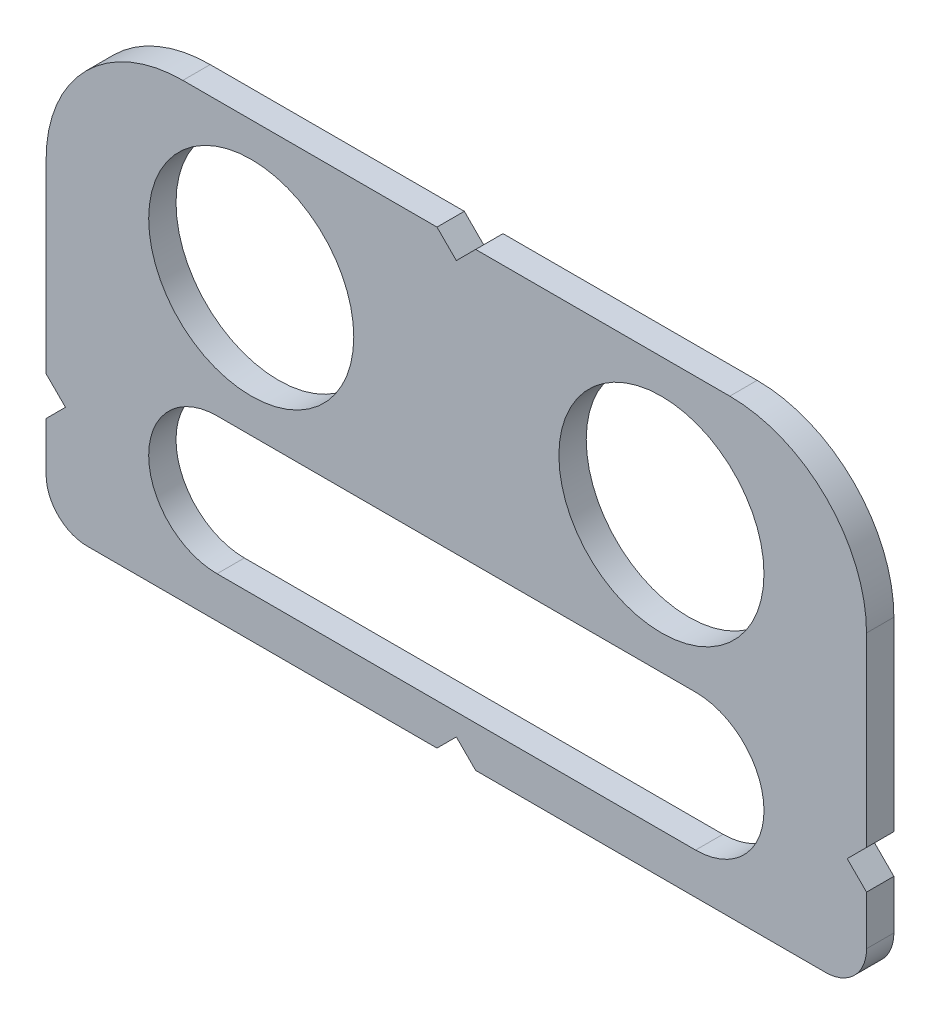
ISO-10303-21;
HEADER;
FILE_DESCRIPTION(('STEP AP214'),'2;1');
FILE_NAME('part.step','',(''),(''),'','','');
FILE_SCHEMA(('AUTOMOTIVE_DESIGN { 1 0 10303 214 1 1 1 1 }'));
ENDSEC;
DATA;
#1=APPLICATION_CONTEXT('core data for automotive mechanical design processes');
#2=APPLICATION_PROTOCOL_DEFINITION('international standard','automotive_design',2000,#1);
#3=PRODUCT_CONTEXT('',#1,'mechanical');
#4=PRODUCT('Part','Part','',(#3));
#5=PRODUCT_RELATED_PRODUCT_CATEGORY('part','',(#4));
#6=PRODUCT_DEFINITION_FORMATION('','',#4);
#7=PRODUCT_DEFINITION_CONTEXT('part definition',#1,'design');
#8=PRODUCT_DEFINITION('design','',#6,#7);
#9=PRODUCT_DEFINITION_SHAPE('','',#8);
#10=(LENGTH_UNIT() NAMED_UNIT(*) SI_UNIT(.MILLI.,.METRE.));
#11=(NAMED_UNIT(*) PLANE_ANGLE_UNIT() SI_UNIT($,.RADIAN.));
#12=(NAMED_UNIT(*) SI_UNIT($,.STERADIAN.) SOLID_ANGLE_UNIT());
#13=UNCERTAINTY_MEASURE_WITH_UNIT(LENGTH_MEASURE(1.E-05),#10,'distance_accuracy_value','');
#14=(GEOMETRIC_REPRESENTATION_CONTEXT(3) GLOBAL_UNCERTAINTY_ASSIGNED_CONTEXT((#13)) GLOBAL_UNIT_ASSIGNED_CONTEXT((#10,
#11,#12)) REPRESENTATION_CONTEXT('',''));
#15=CARTESIAN_POINT('',(0.,0.,0.));
#16=DIRECTION('',(0.,0.,1.));
#17=DIRECTION('',(1.,0.,0.));
#18=AXIS2_PLACEMENT_3D('',#15,#16,#17);
#19=CARTESIAN_POINT('',(20.,15.,2.));
#20=DIRECTION('',(0.,0.,-1.));
#21=DIRECTION('',(-1.,0.,0.));
#22=AXIS2_PLACEMENT_3D('',#19,#20,#21);
#23=PLANE('',#22);
#24=CARTESIAN_POINT('',(-15.,15.,2.));
#25=DIRECTION('',(0.,0.,1.));
#26=DIRECTION('',(-1.,0.,0.));
#27=AXIS2_PLACEMENT_3D('',#24,#25,#26);
#28=CIRCLE('',#27,7.5);
#29=CARTESIAN_POINT('',(-22.5,15.,2.));
#30=VERTEX_POINT('',#29);
#31=EDGE_CURVE('E234',#30,#30,#28,.T.);
#32=ORIENTED_EDGE('',*,*,#31,.F.);
#33=EDGE_LOOP('',(#32));
#34=FACE_BOUND('',#33,.T.);
#35=CARTESIAN_POINT('',(15.,15.,2.));
#36=DIRECTION('',(0.,0.,1.));
#37=DIRECTION('',(1.,0.,0.));
#38=AXIS2_PLACEMENT_3D('',#35,#36,#37);
#39=CIRCLE('',#38,7.5);
#40=CARTESIAN_POINT('',(22.5,15.,2.));
#41=VERTEX_POINT('',#40);
#42=EDGE_CURVE('E240',#41,#41,#39,.T.);
#43=ORIENTED_EDGE('',*,*,#42,.F.);
#44=EDGE_LOOP('',(#43));
#45=FACE_BOUND('',#44,.T.);
#46=CARTESIAN_POINT('',(20.,15.,2.));
#47=DIRECTION('',(0.,0.,1.));
#48=DIRECTION('',(-1.,0.,0.));
#49=AXIS2_PLACEMENT_3D('',#46,#47,#48);
#50=CIRCLE('',#49,9.99999999999999);
#51=CARTESIAN_POINT('',(30.,15.,2.));
#52=VERTEX_POINT('',#51);
#53=CARTESIAN_POINT('',(20.,25.,2.));
#54=VERTEX_POINT('',#53);
#55=EDGE_CURVE('E246',#52,#54,#50,.T.);
#56=ORIENTED_EDGE('',*,*,#55,.T.);
#57=DIRECTION('',(-1.,0.,0.));
#58=VECTOR('',#57,1.);
#59=CARTESIAN_POINT('',(1.41421356237311,25.,2.));
#60=LINE('',#59,#58);
#61=CARTESIAN_POINT('',(1.41421356237311,25.,2.));
#62=VERTEX_POINT('',#61);
#63=EDGE_CURVE('E249',#54,#62,#60,.T.);
#64=ORIENTED_EDGE('',*,*,#63,.T.);
#65=DIRECTION('',(-0.707106781186555,-0.70710678118654,0.));
#66=VECTOR('',#65,1.);
#67=CARTESIAN_POINT('',(1.41421356237311,25.,2.));
#68=LINE('',#67,#66);
#69=CARTESIAN_POINT('',(0.,23.5857864376269,2.));
#70=VERTEX_POINT('',#69);
#71=EDGE_CURVE('E252',#62,#70,#68,.T.);
#72=ORIENTED_EDGE('',*,*,#71,.T.);
#73=DIRECTION('',(-0.707106781186555,0.70710678118654,0.));
#74=VECTOR('',#73,1.);
#75=CARTESIAN_POINT('',(-1.41421356237311,25.,2.));
#76=LINE('',#75,#74);
#77=CARTESIAN_POINT('',(-1.41421356237311,25.,2.));
#78=VERTEX_POINT('',#77);
#79=EDGE_CURVE('E254',#70,#78,#76,.T.);
#80=ORIENTED_EDGE('',*,*,#79,.T.);
#81=DIRECTION('',(-1.,0.,0.));
#82=VECTOR('',#81,1.);
#83=CARTESIAN_POINT('',(-20.,25.,2.));
#84=LINE('',#83,#82);
#85=CARTESIAN_POINT('',(-20.,25.,2.));
#86=VERTEX_POINT('',#85);
#87=EDGE_CURVE('E256',#78,#86,#84,.T.);
#88=ORIENTED_EDGE('',*,*,#87,.T.);
#89=CARTESIAN_POINT('',(-20.,15.,2.));
#90=DIRECTION('',(0.,0.,1.));
#91=DIRECTION('',(1.,0.,0.));
#92=AXIS2_PLACEMENT_3D('',#89,#90,#91);
#93=CIRCLE('',#92,9.99999999999999);
#94=CARTESIAN_POINT('',(-30.,15.,2.));
#95=VERTEX_POINT('',#94);
#96=EDGE_CURVE('E258',#86,#95,#93,.T.);
#97=ORIENTED_EDGE('',*,*,#96,.T.);
#98=DIRECTION('',(0.,-1.,0.));
#99=VECTOR('',#98,1.);
#100=CARTESIAN_POINT('',(-30.,15.,2.));
#101=LINE('',#100,#99);
#102=CARTESIAN_POINT('',(-30.,1.41421356237307,2.));
#103=VERTEX_POINT('',#102);
#104=EDGE_CURVE('E260',#95,#103,#101,.T.);
#105=ORIENTED_EDGE('',*,*,#104,.T.);
#106=DIRECTION('',(0.707106781186552,-0.707106781186543,0.));
#107=VECTOR('',#106,1.);
#108=CARTESIAN_POINT('',(-30.,1.41421356237307,2.));
#109=LINE('',#108,#107);
#110=CARTESIAN_POINT('',(-28.5857864376269,0.,2.));
#111=VERTEX_POINT('',#110);
#112=EDGE_CURVE('E262',#103,#111,#109,.T.);
#113=ORIENTED_EDGE('',*,*,#112,.T.);
#114=DIRECTION('',(-0.707106781186545,-0.70710678118655,0.));
#115=VECTOR('',#114,1.);
#116=CARTESIAN_POINT('',(-28.5857864376269,0.,2.));
#117=LINE('',#116,#115);
#118=CARTESIAN_POINT('',(-30.,-1.4142135623731,2.));
#119=VERTEX_POINT('',#118);
#120=EDGE_CURVE('E264',#111,#119,#117,.T.);
#121=ORIENTED_EDGE('',*,*,#120,.T.);
#122=DIRECTION('',(0.,-1.,0.));
#123=VECTOR('',#122,1.);
#124=CARTESIAN_POINT('',(-30.,-1.4142135623731,2.));
#125=LINE('',#124,#123);
#126=CARTESIAN_POINT('',(-30.,-4.99999999999998,2.));
#127=VERTEX_POINT('',#126);
#128=EDGE_CURVE('E266',#119,#127,#125,.T.);
#129=ORIENTED_EDGE('',*,*,#128,.T.);
#130=CARTESIAN_POINT('',(-27.,-5.,2.));
#131=DIRECTION('',(0.,0.,1.));
#132=DIRECTION('',(1.,0.,0.));
#133=AXIS2_PLACEMENT_3D('',#130,#131,#132);
#134=CIRCLE('',#133,3.);
#135=CARTESIAN_POINT('',(-27.,-8.,2.));
#136=VERTEX_POINT('',#135);
#137=EDGE_CURVE('E268',#127,#136,#134,.T.);
#138=ORIENTED_EDGE('',*,*,#137,.T.);
#139=DIRECTION('',(1.,0.,0.));
#140=VECTOR('',#139,1.);
#141=CARTESIAN_POINT('',(-27.,-8.,2.));
#142=LINE('',#141,#140);
#143=CARTESIAN_POINT('',(-1.41421356237308,-8.,2.));
#144=VERTEX_POINT('',#143);
#145=EDGE_CURVE('E270',#136,#144,#142,.T.);
#146=ORIENTED_EDGE('',*,*,#145,.T.);
#147=DIRECTION('',(0.707106781186542,0.707106781186553,0.));
#148=VECTOR('',#147,1.);
#149=CARTESIAN_POINT('',(0.,-6.58578643762689,2.));
#150=LINE('',#149,#148);
#151=CARTESIAN_POINT('',(0.,-6.58578643762689,2.));
#152=VERTEX_POINT('',#151);
#153=EDGE_CURVE('E272',#144,#152,#150,.T.);
#154=ORIENTED_EDGE('',*,*,#153,.T.);
#155=DIRECTION('',(0.707106781186542,-0.707106781186553,0.));
#156=VECTOR('',#155,1.);
#157=CARTESIAN_POINT('',(0.,-6.58578643762689,2.));
#158=LINE('',#157,#156);
#159=CARTESIAN_POINT('',(1.41421356237309,-8.,2.));
#160=VERTEX_POINT('',#159);
#161=EDGE_CURVE('E274',#152,#160,#158,.T.);
#162=ORIENTED_EDGE('',*,*,#161,.T.);
#163=DIRECTION('',(1.,0.,0.));
#164=VECTOR('',#163,1.);
#165=CARTESIAN_POINT('',(1.41421356237309,-8.,2.));
#166=LINE('',#165,#164);
#167=CARTESIAN_POINT('',(27.,-7.99999999999999,2.));
#168=VERTEX_POINT('',#167);
#169=EDGE_CURVE('E276',#160,#168,#166,.T.);
#170=ORIENTED_EDGE('',*,*,#169,.T.);
#171=CARTESIAN_POINT('',(27.,-4.99999999999999,2.));
#172=DIRECTION('',(0.,0.,1.));
#173=DIRECTION('',(1.,0.,0.));
#174=AXIS2_PLACEMENT_3D('',#171,#172,#173);
#175=CIRCLE('',#174,3.);
#176=CARTESIAN_POINT('',(30.,-4.99999999999999,2.));
#177=VERTEX_POINT('',#176);
#178=EDGE_CURVE('E278',#168,#177,#175,.T.);
#179=ORIENTED_EDGE('',*,*,#178,.T.);
#180=DIRECTION('',(0.,1.,0.));
#181=VECTOR('',#180,1.);
#182=CARTESIAN_POINT('',(30.,-1.4142135623731,2.));
#183=LINE('',#182,#181);
#184=CARTESIAN_POINT('',(30.,-1.4142135623731,2.));
#185=VERTEX_POINT('',#184);
#186=EDGE_CURVE('E280',#177,#185,#183,.T.);
#187=ORIENTED_EDGE('',*,*,#186,.T.);
#188=DIRECTION('',(-0.707106781186545,0.70710678118655,0.));
#189=VECTOR('',#188,1.);
#190=CARTESIAN_POINT('',(28.5857864376269,0.,2.));
#191=LINE('',#190,#189);
#192=CARTESIAN_POINT('',(28.5857864376269,0.,2.));
#193=VERTEX_POINT('',#192);
#194=EDGE_CURVE('E282',#185,#193,#191,.T.);
#195=ORIENTED_EDGE('',*,*,#194,.T.);
#196=DIRECTION('',(0.707106781186551,0.707106781186544,0.));
#197=VECTOR('',#196,1.);
#198=CARTESIAN_POINT('',(30.,1.41421356237308,2.));
#199=LINE('',#198,#197);
#200=CARTESIAN_POINT('',(30.,1.41421356237308,2.));
#201=VERTEX_POINT('',#200);
#202=EDGE_CURVE('E284',#193,#201,#199,.T.);
#203=ORIENTED_EDGE('',*,*,#202,.T.);
#204=DIRECTION('',(0.,1.,0.));
#205=VECTOR('',#204,1.);
#206=CARTESIAN_POINT('',(30.,15.,2.));
#207=LINE('',#206,#205);
#208=EDGE_CURVE('E286',#201,#52,#207,.T.);
#209=ORIENTED_EDGE('',*,*,#208,.T.);
#210=EDGE_LOOP('',(#56,#64,#72,#80,#88,#97,#105,#113,#121,#129,#138,#146,#154,#162,#170,#179,
#187,#195,#203,#209));
#211=FACE_BOUND('',#210,.T.);
#212=CARTESIAN_POINT('',(-17.5,0.,2.));
#213=DIRECTION('',(0.,0.,1.));
#214=DIRECTION('',(1.,0.,0.));
#215=AXIS2_PLACEMENT_3D('',#212,#213,#214);
#216=CIRCLE('',#215,5.);
#217=CARTESIAN_POINT('',(-17.5,5.,2.));
#218=VERTEX_POINT('',#217);
#219=CARTESIAN_POINT('',(-17.5,-5.,2.));
#220=VERTEX_POINT('',#219);
#221=EDGE_CURVE('E198',#218,#220,#216,.T.);
#222=ORIENTED_EDGE('',*,*,#221,.F.);
#223=DIRECTION('',(-1.,0.,0.));
#224=VECTOR('',#223,1.);
#225=CARTESIAN_POINT('',(-17.5,5.,2.));
#226=LINE('',#225,#224);
#227=CARTESIAN_POINT('',(17.5,5.00000000000001,2.));
#228=VERTEX_POINT('',#227);
#229=EDGE_CURVE('E220',#228,#218,#226,.T.);
#230=ORIENTED_EDGE('',*,*,#229,.F.);
#231=CARTESIAN_POINT('',(17.5,0.,2.));
#232=DIRECTION('',(0.,0.,1.));
#233=DIRECTION('',(1.,0.,0.));
#234=AXIS2_PLACEMENT_3D('',#231,#232,#233);
#235=CIRCLE('',#234,5.);
#236=CARTESIAN_POINT('',(17.5,-4.99999999999999,2.));
#237=VERTEX_POINT('',#236);
#238=EDGE_CURVE('E218',#237,#228,#235,.T.);
#239=ORIENTED_EDGE('',*,*,#238,.F.);
#240=DIRECTION('',(1.,0.,0.));
#241=VECTOR('',#240,1.);
#242=CARTESIAN_POINT('',(-17.5,-5.,2.));
#243=LINE('',#242,#241);
#244=EDGE_CURVE('E206',#220,#237,#243,.T.);
#245=ORIENTED_EDGE('',*,*,#244,.F.);
#246=EDGE_LOOP('',(#222,#230,#239,#245));
#247=FACE_BOUND('',#246,.T.);
#248=ADVANCED_FACE('F37',(#34,#45,#211,#247),#23,.F.);
#249=CARTESIAN_POINT('',(20.,15.,0.));
#250=DIRECTION('',(0.,0.,-1.));
#251=DIRECTION('',(-1.,0.,0.));
#252=AXIS2_PLACEMENT_3D('',#249,#250,#251);
#253=PLANE('',#252);
#254=CARTESIAN_POINT('',(15.,15.,0.));
#255=DIRECTION('',(0.,0.,1.));
#256=DIRECTION('',(1.,0.,0.));
#257=AXIS2_PLACEMENT_3D('',#254,#255,#256);
#258=CIRCLE('',#257,7.5);
#259=CARTESIAN_POINT('',(22.5,15.,0.));
#260=VERTEX_POINT('',#259);
#261=EDGE_CURVE('E237',#260,#260,#258,.T.);
#262=ORIENTED_EDGE('',*,*,#261,.T.);
#263=EDGE_LOOP('',(#262));
#264=FACE_BOUND('',#263,.T.);
#265=CARTESIAN_POINT('',(20.,15.,0.));
#266=DIRECTION('',(0.,0.,1.));
#267=DIRECTION('',(-1.,0.,0.));
#268=AXIS2_PLACEMENT_3D('',#265,#266,#267);
#269=CIRCLE('',#268,9.99999999999999);
#270=CARTESIAN_POINT('',(30.,15.,0.));
#271=VERTEX_POINT('',#270);
#272=CARTESIAN_POINT('',(20.,25.,0.));
#273=VERTEX_POINT('',#272);
#274=EDGE_CURVE('E243',#271,#273,#269,.T.);
#275=ORIENTED_EDGE('',*,*,#274,.F.);
#276=DIRECTION('',(0.,1.,0.));
#277=VECTOR('',#276,1.);
#278=CARTESIAN_POINT('',(30.,15.,0.));
#279=LINE('',#278,#277);
#280=CARTESIAN_POINT('',(30.,1.41421356237308,0.));
#281=VERTEX_POINT('',#280);
#282=EDGE_CURVE('E250',#281,#271,#279,.T.);
#283=ORIENTED_EDGE('',*,*,#282,.F.);
#284=DIRECTION('',(0.707106781186551,0.707106781186544,0.));
#285=VECTOR('',#284,1.);
#286=CARTESIAN_POINT('',(30.,1.41421356237308,0.));
#287=LINE('',#286,#285);
#288=CARTESIAN_POINT('',(28.5857864376269,0.,0.));
#289=VERTEX_POINT('',#288);
#290=EDGE_CURVE('E325',#289,#281,#287,.T.);
#291=ORIENTED_EDGE('',*,*,#290,.F.);
#292=DIRECTION('',(-0.707106781186545,0.70710678118655,0.));
#293=VECTOR('',#292,1.);
#294=CARTESIAN_POINT('',(28.5857864376269,0.,0.));
#295=LINE('',#294,#293);
#296=CARTESIAN_POINT('',(30.,-1.4142135623731,0.));
#297=VERTEX_POINT('',#296);
#298=EDGE_CURVE('E323',#297,#289,#295,.T.);
#299=ORIENTED_EDGE('',*,*,#298,.F.);
#300=DIRECTION('',(0.,1.,0.));
#301=VECTOR('',#300,1.);
#302=CARTESIAN_POINT('',(30.,-1.4142135623731,0.));
#303=LINE('',#302,#301);
#304=CARTESIAN_POINT('',(30.,-4.99999999999999,0.));
#305=VERTEX_POINT('',#304);
#306=EDGE_CURVE('E321',#305,#297,#303,.T.);
#307=ORIENTED_EDGE('',*,*,#306,.F.);
#308=CARTESIAN_POINT('',(27.,-4.99999999999999,0.));
#309=DIRECTION('',(0.,0.,1.));
#310=DIRECTION('',(1.,0.,0.));
#311=AXIS2_PLACEMENT_3D('',#308,#309,#310);
#312=CIRCLE('',#311,3.);
#313=CARTESIAN_POINT('',(27.,-7.99999999999999,0.));
#314=VERTEX_POINT('',#313);
#315=EDGE_CURVE('E319',#314,#305,#312,.T.);
#316=ORIENTED_EDGE('',*,*,#315,.F.);
#317=DIRECTION('',(1.,0.,0.));
#318=VECTOR('',#317,1.);
#319=CARTESIAN_POINT('',(1.41421356237309,-8.,0.));
#320=LINE('',#319,#318);
#321=CARTESIAN_POINT('',(1.41421356237309,-8.,0.));
#322=VERTEX_POINT('',#321);
#323=EDGE_CURVE('E317',#322,#314,#320,.T.);
#324=ORIENTED_EDGE('',*,*,#323,.F.);
#325=DIRECTION('',(0.707106781186542,-0.707106781186553,0.));
#326=VECTOR('',#325,1.);
#327=CARTESIAN_POINT('',(0.,-6.58578643762689,0.));
#328=LINE('',#327,#326);
#329=CARTESIAN_POINT('',(0.,-6.58578643762689,0.));
#330=VERTEX_POINT('',#329);
#331=EDGE_CURVE('E315',#330,#322,#328,.T.);
#332=ORIENTED_EDGE('',*,*,#331,.F.);
#333=DIRECTION('',(0.707106781186542,0.707106781186553,0.));
#334=VECTOR('',#333,1.);
#335=CARTESIAN_POINT('',(0.,-6.58578643762689,0.));
#336=LINE('',#335,#334);
#337=CARTESIAN_POINT('',(-1.41421356237308,-8.,0.));
#338=VERTEX_POINT('',#337);
#339=EDGE_CURVE('E313',#338,#330,#336,.T.);
#340=ORIENTED_EDGE('',*,*,#339,.F.);
#341=DIRECTION('',(1.,0.,0.));
#342=VECTOR('',#341,1.);
#343=CARTESIAN_POINT('',(-27.,-8.,0.));
#344=LINE('',#343,#342);
#345=CARTESIAN_POINT('',(-27.,-8.,0.));
#346=VERTEX_POINT('',#345);
#347=EDGE_CURVE('E311',#346,#338,#344,.T.);
#348=ORIENTED_EDGE('',*,*,#347,.F.);
#349=CARTESIAN_POINT('',(-27.,-5.,0.));
#350=DIRECTION('',(0.,0.,1.));
#351=DIRECTION('',(1.,0.,0.));
#352=AXIS2_PLACEMENT_3D('',#349,#350,#351);
#353=CIRCLE('',#352,3.);
#354=CARTESIAN_POINT('',(-30.,-4.99999999999998,0.));
#355=VERTEX_POINT('',#354);
#356=EDGE_CURVE('E309',#355,#346,#353,.T.);
#357=ORIENTED_EDGE('',*,*,#356,.F.);
#358=DIRECTION('',(0.,-1.,0.));
#359=VECTOR('',#358,1.);
#360=CARTESIAN_POINT('',(-30.,-1.4142135623731,0.));
#361=LINE('',#360,#359);
#362=CARTESIAN_POINT('',(-30.,-1.4142135623731,0.));
#363=VERTEX_POINT('',#362);
#364=EDGE_CURVE('E307',#363,#355,#361,.T.);
#365=ORIENTED_EDGE('',*,*,#364,.F.);
#366=DIRECTION('',(-0.707106781186545,-0.70710678118655,0.));
#367=VECTOR('',#366,1.);
#368=CARTESIAN_POINT('',(-28.5857864376269,0.,0.));
#369=LINE('',#368,#367);
#370=CARTESIAN_POINT('',(-28.5857864376269,0.,0.));
#371=VERTEX_POINT('',#370);
#372=EDGE_CURVE('E305',#371,#363,#369,.T.);
#373=ORIENTED_EDGE('',*,*,#372,.F.);
#374=DIRECTION('',(0.707106781186552,-0.707106781186543,0.));
#375=VECTOR('',#374,1.);
#376=CARTESIAN_POINT('',(-30.,1.41421356237307,0.));
#377=LINE('',#376,#375);
#378=CARTESIAN_POINT('',(-30.,1.41421356237307,0.));
#379=VERTEX_POINT('',#378);
#380=EDGE_CURVE('E303',#379,#371,#377,.T.);
#381=ORIENTED_EDGE('',*,*,#380,.F.);
#382=DIRECTION('',(0.,-1.,0.));
#383=VECTOR('',#382,1.);
#384=CARTESIAN_POINT('',(-30.,15.,0.));
#385=LINE('',#384,#383);
#386=CARTESIAN_POINT('',(-30.,15.,0.));
#387=VERTEX_POINT('',#386);
#388=EDGE_CURVE('E301',#387,#379,#385,.T.);
#389=ORIENTED_EDGE('',*,*,#388,.F.);
#390=CARTESIAN_POINT('',(-20.,15.,0.));
#391=DIRECTION('',(0.,0.,1.));
#392=DIRECTION('',(1.,0.,0.));
#393=AXIS2_PLACEMENT_3D('',#390,#391,#392);
#394=CIRCLE('',#393,9.99999999999999);
#395=CARTESIAN_POINT('',(-20.,25.,0.));
#396=VERTEX_POINT('',#395);
#397=EDGE_CURVE('E299',#396,#387,#394,.T.);
#398=ORIENTED_EDGE('',*,*,#397,.F.);
#399=DIRECTION('',(-1.,0.,0.));
#400=VECTOR('',#399,1.);
#401=CARTESIAN_POINT('',(-20.,25.,0.));
#402=LINE('',#401,#400);
#403=CARTESIAN_POINT('',(-1.41421356237311,25.,0.));
#404=VERTEX_POINT('',#403);
#405=EDGE_CURVE('E297',#404,#396,#402,.T.);
#406=ORIENTED_EDGE('',*,*,#405,.F.);
#407=DIRECTION('',(-0.707106781186555,0.70710678118654,0.));
#408=VECTOR('',#407,1.);
#409=CARTESIAN_POINT('',(-1.41421356237311,25.,0.));
#410=LINE('',#409,#408);
#411=CARTESIAN_POINT('',(0.,23.5857864376269,0.));
#412=VERTEX_POINT('',#411);
#413=EDGE_CURVE('E295',#412,#404,#410,.T.);
#414=ORIENTED_EDGE('',*,*,#413,.F.);
#415=DIRECTION('',(-0.707106781186555,-0.70710678118654,0.));
#416=VECTOR('',#415,1.);
#417=CARTESIAN_POINT('',(1.41421356237311,25.,0.));
#418=LINE('',#417,#416);
#419=CARTESIAN_POINT('',(1.41421356237311,25.,0.));
#420=VERTEX_POINT('',#419);
#421=EDGE_CURVE('E293',#420,#412,#418,.T.);
#422=ORIENTED_EDGE('',*,*,#421,.F.);
#423=DIRECTION('',(-1.,0.,0.));
#424=VECTOR('',#423,1.);
#425=CARTESIAN_POINT('',(1.41421356237311,25.,0.));
#426=LINE('',#425,#424);
#427=EDGE_CURVE('E291',#273,#420,#426,.T.);
#428=ORIENTED_EDGE('',*,*,#427,.F.);
#429=EDGE_LOOP('',(#275,#283,#291,#299,#307,#316,#324,#332,#340,#348,#357,#365,#373,#381,#389,
#398,#406,#414,#422,#428));
#430=FACE_BOUND('',#429,.T.);
#431=CARTESIAN_POINT('',(-15.,15.,0.));
#432=DIRECTION('',(0.,0.,1.));
#433=DIRECTION('',(-1.,0.,0.));
#434=AXIS2_PLACEMENT_3D('',#431,#432,#433);
#435=CIRCLE('',#434,7.5);
#436=CARTESIAN_POINT('',(-22.5,15.,0.));
#437=VERTEX_POINT('',#436);
#438=EDGE_CURVE('E214',#437,#437,#435,.T.);
#439=ORIENTED_EDGE('',*,*,#438,.T.);
#440=EDGE_LOOP('',(#439));
#441=FACE_BOUND('',#440,.T.);
#442=DIRECTION('',(-1.,0.,0.));
#443=VECTOR('',#442,1.);
#444=CARTESIAN_POINT('',(-17.5,5.,0.));
#445=LINE('',#444,#443);
#446=CARTESIAN_POINT('',(17.5,5.00000000000001,0.));
#447=VERTEX_POINT('',#446);
#448=CARTESIAN_POINT('',(-17.5,5.,0.));
#449=VERTEX_POINT('',#448);
#450=EDGE_CURVE('E207',#447,#449,#445,.T.);
#451=ORIENTED_EDGE('',*,*,#450,.T.);
#452=CARTESIAN_POINT('',(-17.5,0.,0.));
#453=DIRECTION('',(0.,0.,1.));
#454=DIRECTION('',(1.,0.,0.));
#455=AXIS2_PLACEMENT_3D('',#452,#453,#454);
#456=CIRCLE('',#455,5.);
#457=CARTESIAN_POINT('',(-17.5,-5.,0.));
#458=VERTEX_POINT('',#457);
#459=EDGE_CURVE('E60',#449,#458,#456,.T.);
#460=ORIENTED_EDGE('',*,*,#459,.T.);
#461=DIRECTION('',(1.,0.,0.));
#462=VECTOR('',#461,1.);
#463=CARTESIAN_POINT('',(-17.5,-5.,0.));
#464=LINE('',#463,#462);
#465=CARTESIAN_POINT('',(17.5,-4.99999999999999,0.));
#466=VERTEX_POINT('',#465);
#467=EDGE_CURVE('E213',#458,#466,#464,.T.);
#468=ORIENTED_EDGE('',*,*,#467,.T.);
#469=CARTESIAN_POINT('',(17.5,0.,0.));
#470=DIRECTION('',(0.,0.,1.));
#471=DIRECTION('',(1.,0.,0.));
#472=AXIS2_PLACEMENT_3D('',#469,#470,#471);
#473=CIRCLE('',#472,5.);
#474=EDGE_CURVE('E226',#466,#447,#473,.T.);
#475=ORIENTED_EDGE('',*,*,#474,.T.);
#476=EDGE_LOOP('',(#451,#460,#468,#475));
#477=FACE_BOUND('',#476,.T.);
#478=ADVANCED_FACE('F391',(#264,#430,#441,#477),#253,.T.);
#479=CARTESIAN_POINT('',(20.,15.,2.));
#480=DIRECTION('',(0.,0.,-1.));
#481=DIRECTION('',(-1.,0.,0.));
#482=AXIS2_PLACEMENT_3D('',#479,#480,#481);
#483=CYLINDRICAL_SURFACE('',#482,9.99999999999999);
#484=ORIENTED_EDGE('',*,*,#274,.T.);
#485=DIRECTION('',(0.,0.,-1.));
#486=VECTOR('',#485,1.);
#487=CARTESIAN_POINT('',(20.,25.,2.));
#488=LINE('',#487,#486);
#489=EDGE_CURVE('E11',#54,#273,#488,.T.);
#490=ORIENTED_EDGE('',*,*,#489,.F.);
#491=ORIENTED_EDGE('',*,*,#55,.F.);
#492=DIRECTION('',(0.,0.,-1.));
#493=VECTOR('',#492,1.);
#494=CARTESIAN_POINT('',(30.,15.,2.));
#495=LINE('',#494,#493);
#496=EDGE_CURVE('E288',#52,#271,#495,.T.);
#497=ORIENTED_EDGE('',*,*,#496,.T.);
#498=EDGE_LOOP('',(#484,#490,#491,#497));
#499=FACE_BOUND('',#498,.T.);
#500=ADVANCED_FACE('F39',(#499),#483,.T.);
#501=CARTESIAN_POINT('',(1.41421356237311,25.,2.));
#502=DIRECTION('',(0.,-1.,0.));
#503=DIRECTION('',(1.,0.,0.));
#504=AXIS2_PLACEMENT_3D('',#501,#502,#503);
#505=PLANE('',#504);
#506=ORIENTED_EDGE('',*,*,#427,.T.);
#507=DIRECTION('',(0.,0.,-1.));
#508=VECTOR('',#507,1.);
#509=CARTESIAN_POINT('',(1.41421356237311,25.,2.));
#510=LINE('',#509,#508);
#511=EDGE_CURVE('E45',#62,#420,#510,.T.);
#512=ORIENTED_EDGE('',*,*,#511,.F.);
#513=ORIENTED_EDGE('',*,*,#63,.F.);
#514=ORIENTED_EDGE('',*,*,#489,.T.);
#515=EDGE_LOOP('',(#506,#512,#513,#514));
#516=FACE_BOUND('',#515,.T.);
#517=ADVANCED_FACE('F408',(#516),#505,.F.);
#518=CARTESIAN_POINT('',(1.41421356237311,25.,2.));
#519=DIRECTION('',(0.70710678118654,-0.707106781186555,0.));
#520=DIRECTION('',(0.707106781186555,0.70710678118654,0.));
#521=AXIS2_PLACEMENT_3D('',#518,#519,#520);
#522=PLANE('',#521);
#523=ORIENTED_EDGE('',*,*,#421,.T.);
#524=DIRECTION('',(0.,0.,-1.));
#525=VECTOR('',#524,1.);
#526=CARTESIAN_POINT('',(0.,23.5857864376269,2.));
#527=LINE('',#526,#525);
#528=EDGE_CURVE('E378',#70,#412,#527,.T.);
#529=ORIENTED_EDGE('',*,*,#528,.F.);
#530=ORIENTED_EDGE('',*,*,#71,.F.);
#531=ORIENTED_EDGE('',*,*,#511,.T.);
#532=EDGE_LOOP('',(#523,#529,#530,#531));
#533=FACE_BOUND('',#532,.T.);
#534=ADVANCED_FACE('F385',(#533),#522,.F.);
#535=CARTESIAN_POINT('',(-1.41421356237311,25.,2.));
#536=DIRECTION('',(-0.70710678118654,-0.707106781186555,0.));
#537=DIRECTION('',(0.707106781186555,-0.70710678118654,0.));
#538=AXIS2_PLACEMENT_3D('',#535,#536,#537);
#539=PLANE('',#538);
#540=ORIENTED_EDGE('',*,*,#413,.T.);
#541=DIRECTION('',(0.,0.,-1.));
#542=VECTOR('',#541,1.);
#543=CARTESIAN_POINT('',(-1.41421356237311,25.,2.));
#544=LINE('',#543,#542);
#545=EDGE_CURVE('E375',#78,#404,#544,.T.);
#546=ORIENTED_EDGE('',*,*,#545,.F.);
#547=ORIENTED_EDGE('',*,*,#79,.F.);
#548=ORIENTED_EDGE('',*,*,#528,.T.);
#549=EDGE_LOOP('',(#540,#546,#547,#548));
#550=FACE_BOUND('',#549,.T.);
#551=ADVANCED_FACE('F397',(#550),#539,.F.);
#552=CARTESIAN_POINT('',(-20.,25.,2.));
#553=DIRECTION('',(0.,-1.,0.));
#554=DIRECTION('',(1.,0.,0.));
#555=AXIS2_PLACEMENT_3D('',#552,#553,#554);
#556=PLANE('',#555);
#557=ORIENTED_EDGE('',*,*,#405,.T.);
#558=DIRECTION('',(0.,0.,-1.));
#559=VECTOR('',#558,1.);
#560=CARTESIAN_POINT('',(-20.,25.,2.));
#561=LINE('',#560,#559);
#562=EDGE_CURVE('E372',#86,#396,#561,.T.);
#563=ORIENTED_EDGE('',*,*,#562,.F.);
#564=ORIENTED_EDGE('',*,*,#87,.F.);
#565=ORIENTED_EDGE('',*,*,#545,.T.);
#566=EDGE_LOOP('',(#557,#563,#564,#565));
#567=FACE_BOUND('',#566,.T.);
#568=ADVANCED_FACE('F401',(#567),#556,.F.);
#569=CARTESIAN_POINT('',(-20.,15.,2.));
#570=DIRECTION('',(0.,0.,-1.));
#571=DIRECTION('',(-1.,0.,0.));
#572=AXIS2_PLACEMENT_3D('',#569,#570,#571);
#573=CYLINDRICAL_SURFACE('',#572,9.99999999999999);
#574=ORIENTED_EDGE('',*,*,#397,.T.);
#575=DIRECTION('',(0.,0.,-1.));
#576=VECTOR('',#575,1.);
#577=CARTESIAN_POINT('',(-30.,15.,2.));
#578=LINE('',#577,#576);
#579=EDGE_CURVE('E369',#95,#387,#578,.T.);
#580=ORIENTED_EDGE('',*,*,#579,.F.);
#581=ORIENTED_EDGE('',*,*,#96,.F.);
#582=ORIENTED_EDGE('',*,*,#562,.T.);
#583=EDGE_LOOP('',(#574,#580,#581,#582));
#584=FACE_BOUND('',#583,.T.);
#585=ADVANCED_FACE('F481',(#584),#573,.T.);
#586=CARTESIAN_POINT('',(-30.,15.,2.));
#587=DIRECTION('',(1.,0.,0.));
#588=DIRECTION('',(0.,1.,0.));
#589=AXIS2_PLACEMENT_3D('',#586,#587,#588);
#590=PLANE('',#589);
#591=ORIENTED_EDGE('',*,*,#388,.T.);
#592=DIRECTION('',(0.,0.,-1.));
#593=VECTOR('',#592,1.);
#594=CARTESIAN_POINT('',(-30.,1.41421356237307,2.));
#595=LINE('',#594,#593);
#596=EDGE_CURVE('E366',#103,#379,#595,.T.);
#597=ORIENTED_EDGE('',*,*,#596,.F.);
#598=ORIENTED_EDGE('',*,*,#104,.F.);
#599=ORIENTED_EDGE('',*,*,#579,.T.);
#600=EDGE_LOOP('',(#591,#597,#598,#599));
#601=FACE_BOUND('',#600,.T.);
#602=ADVANCED_FACE('F479',(#601),#590,.F.);
#603=CARTESIAN_POINT('',(-30.,1.41421356237307,2.));
#604=DIRECTION('',(0.707106781186543,0.707106781186552,0.));
#605=DIRECTION('',(-0.707106781186552,0.707106781186543,0.));
#606=AXIS2_PLACEMENT_3D('',#603,#604,#605);
#607=PLANE('',#606);
#608=ORIENTED_EDGE('',*,*,#380,.T.);
#609=DIRECTION('',(0.,0.,-1.));
#610=VECTOR('',#609,1.);
#611=CARTESIAN_POINT('',(-28.5857864376269,0.,2.));
#612=LINE('',#611,#610);
#613=EDGE_CURVE('E363',#111,#371,#612,.T.);
#614=ORIENTED_EDGE('',*,*,#613,.F.);
#615=ORIENTED_EDGE('',*,*,#112,.F.);
#616=ORIENTED_EDGE('',*,*,#596,.T.);
#617=EDGE_LOOP('',(#608,#614,#615,#616));
#618=FACE_BOUND('',#617,.T.);
#619=ADVANCED_FACE('F474',(#618),#607,.F.);
#620=CARTESIAN_POINT('',(-28.5857864376269,0.,2.));
#621=DIRECTION('',(0.70710678118655,-0.707106781186545,0.));
#622=DIRECTION('',(0.707106781186545,0.70710678118655,0.));
#623=AXIS2_PLACEMENT_3D('',#620,#621,#622);
#624=PLANE('',#623);
#625=ORIENTED_EDGE('',*,*,#372,.T.);
#626=DIRECTION('',(0.,0.,-1.));
#627=VECTOR('',#626,1.);
#628=CARTESIAN_POINT('',(-30.,-1.4142135623731,2.));
#629=LINE('',#628,#627);
#630=EDGE_CURVE('E360',#119,#363,#629,.T.);
#631=ORIENTED_EDGE('',*,*,#630,.F.);
#632=ORIENTED_EDGE('',*,*,#120,.F.);
#633=ORIENTED_EDGE('',*,*,#613,.T.);
#634=EDGE_LOOP('',(#625,#631,#632,#633));
#635=FACE_BOUND('',#634,.T.);
#636=ADVANCED_FACE('F469',(#635),#624,.F.);
#637=CARTESIAN_POINT('',(-30.,-1.4142135623731,2.));
#638=DIRECTION('',(1.,0.,0.));
#639=DIRECTION('',(0.,1.,0.));
#640=AXIS2_PLACEMENT_3D('',#637,#638,#639);
#641=PLANE('',#640);
#642=ORIENTED_EDGE('',*,*,#364,.T.);
#643=DIRECTION('',(0.,0.,-1.));
#644=VECTOR('',#643,1.);
#645=CARTESIAN_POINT('',(-30.,-4.99999999999998,2.));
#646=LINE('',#645,#644);
#647=EDGE_CURVE('E357',#127,#355,#646,.T.);
#648=ORIENTED_EDGE('',*,*,#647,.F.);
#649=ORIENTED_EDGE('',*,*,#128,.F.);
#650=ORIENTED_EDGE('',*,*,#630,.T.);
#651=EDGE_LOOP('',(#642,#648,#649,#650));
#652=FACE_BOUND('',#651,.T.);
#653=ADVANCED_FACE('F465',(#652),#641,.F.);
#654=CARTESIAN_POINT('',(-27.,-5.,2.));
#655=DIRECTION('',(0.,0.,-1.));
#656=DIRECTION('',(-1.,0.,0.));
#657=AXIS2_PLACEMENT_3D('',#654,#655,#656);
#658=CYLINDRICAL_SURFACE('',#657,3.);
#659=ORIENTED_EDGE('',*,*,#356,.T.);
#660=DIRECTION('',(0.,0.,-1.));
#661=VECTOR('',#660,1.);
#662=CARTESIAN_POINT('',(-27.,-8.,2.));
#663=LINE('',#662,#661);
#664=EDGE_CURVE('E354',#136,#346,#663,.T.);
#665=ORIENTED_EDGE('',*,*,#664,.F.);
#666=ORIENTED_EDGE('',*,*,#137,.F.);
#667=ORIENTED_EDGE('',*,*,#647,.T.);
#668=EDGE_LOOP('',(#659,#665,#666,#667));
#669=FACE_BOUND('',#668,.T.);
#670=ADVANCED_FACE('F460',(#669),#658,.T.);
#671=CARTESIAN_POINT('',(-27.,-8.,2.));
#672=DIRECTION('',(0.,1.,0.));
#673=DIRECTION('',(0.,0.,1.));
#674=AXIS2_PLACEMENT_3D('',#671,#672,#673);
#675=PLANE('',#674);
#676=ORIENTED_EDGE('',*,*,#347,.T.);
#677=DIRECTION('',(0.,0.,-1.));
#678=VECTOR('',#677,1.);
#679=CARTESIAN_POINT('',(-1.41421356237308,-8.,2.));
#680=LINE('',#679,#678);
#681=EDGE_CURVE('E351',#144,#338,#680,.T.);
#682=ORIENTED_EDGE('',*,*,#681,.F.);
#683=ORIENTED_EDGE('',*,*,#145,.F.);
#684=ORIENTED_EDGE('',*,*,#664,.T.);
#685=EDGE_LOOP('',(#676,#682,#683,#684));
#686=FACE_BOUND('',#685,.T.);
#687=ADVANCED_FACE('F454',(#686),#675,.F.);
#688=CARTESIAN_POINT('',(0.,-6.58578643762689,2.));
#689=DIRECTION('',(-0.707106781186553,0.707106781186542,0.));
#690=DIRECTION('',(-0.707106781186542,-0.707106781186553,0.));
#691=AXIS2_PLACEMENT_3D('',#688,#689,#690);
#692=PLANE('',#691);
#693=ORIENTED_EDGE('',*,*,#339,.T.);
#694=DIRECTION('',(0.,0.,-1.));
#695=VECTOR('',#694,1.);
#696=CARTESIAN_POINT('',(0.,-6.58578643762689,2.));
#697=LINE('',#696,#695);
#698=EDGE_CURVE('E348',#152,#330,#697,.T.);
#699=ORIENTED_EDGE('',*,*,#698,.F.);
#700=ORIENTED_EDGE('',*,*,#153,.F.);
#701=ORIENTED_EDGE('',*,*,#681,.T.);
#702=EDGE_LOOP('',(#693,#699,#700,#701));
#703=FACE_BOUND('',#702,.T.);
#704=ADVANCED_FACE('F450',(#703),#692,.F.);
#705=CARTESIAN_POINT('',(0.,-6.58578643762689,2.));
#706=DIRECTION('',(0.707106781186553,0.707106781186542,0.));
#707=DIRECTION('',(-0.707106781186542,0.707106781186553,0.));
#708=AXIS2_PLACEMENT_3D('',#705,#706,#707);
#709=PLANE('',#708);
#710=ORIENTED_EDGE('',*,*,#331,.T.);
#711=DIRECTION('',(0.,0.,-1.));
#712=VECTOR('',#711,1.);
#713=CARTESIAN_POINT('',(1.41421356237309,-8.,2.));
#714=LINE('',#713,#712);
#715=EDGE_CURVE('E345',#160,#322,#714,.T.);
#716=ORIENTED_EDGE('',*,*,#715,.F.);
#717=ORIENTED_EDGE('',*,*,#161,.F.);
#718=ORIENTED_EDGE('',*,*,#698,.T.);
#719=EDGE_LOOP('',(#710,#716,#717,#718));
#720=FACE_BOUND('',#719,.T.);
#721=ADVANCED_FACE('F445',(#720),#709,.F.);
#722=CARTESIAN_POINT('',(1.41421356237309,-8.,2.));
#723=DIRECTION('',(0.,1.,0.));
#724=DIRECTION('',(-1.,0.,0.));
#725=AXIS2_PLACEMENT_3D('',#722,#723,#724);
#726=PLANE('',#725);
#727=ORIENTED_EDGE('',*,*,#323,.T.);
#728=DIRECTION('',(0.,0.,-1.));
#729=VECTOR('',#728,1.);
#730=CARTESIAN_POINT('',(27.,-7.99999999999999,2.));
#731=LINE('',#730,#729);
#732=EDGE_CURVE('E342',#168,#314,#731,.T.);
#733=ORIENTED_EDGE('',*,*,#732,.F.);
#734=ORIENTED_EDGE('',*,*,#169,.F.);
#735=ORIENTED_EDGE('',*,*,#715,.T.);
#736=EDGE_LOOP('',(#727,#733,#734,#735));
#737=FACE_BOUND('',#736,.T.);
#738=ADVANCED_FACE('F439',(#737),#726,.F.);
#739=CARTESIAN_POINT('',(27.,-4.99999999999999,2.));
#740=DIRECTION('',(0.,0.,-1.));
#741=DIRECTION('',(-1.,0.,0.));
#742=AXIS2_PLACEMENT_3D('',#739,#740,#741);
#743=CYLINDRICAL_SURFACE('',#742,3.);
#744=ORIENTED_EDGE('',*,*,#315,.T.);
#745=DIRECTION('',(0.,0.,-1.));
#746=VECTOR('',#745,1.);
#747=CARTESIAN_POINT('',(30.,-4.99999999999999,2.));
#748=LINE('',#747,#746);
#749=EDGE_CURVE('E339',#177,#305,#748,.T.);
#750=ORIENTED_EDGE('',*,*,#749,.F.);
#751=ORIENTED_EDGE('',*,*,#178,.F.);
#752=ORIENTED_EDGE('',*,*,#732,.T.);
#753=EDGE_LOOP('',(#744,#750,#751,#752));
#754=FACE_BOUND('',#753,.T.);
#755=ADVANCED_FACE('F435',(#754),#743,.T.);
#756=CARTESIAN_POINT('',(30.,-1.4142135623731,2.));
#757=DIRECTION('',(-1.,0.,0.));
#758=DIRECTION('',(0.,-1.,0.));
#759=AXIS2_PLACEMENT_3D('',#756,#757,#758);
#760=PLANE('',#759);
#761=ORIENTED_EDGE('',*,*,#306,.T.);
#762=DIRECTION('',(0.,0.,-1.));
#763=VECTOR('',#762,1.);
#764=CARTESIAN_POINT('',(30.,-1.4142135623731,2.));
#765=LINE('',#764,#763);
#766=EDGE_CURVE('E336',#185,#297,#765,.T.);
#767=ORIENTED_EDGE('',*,*,#766,.F.);
#768=ORIENTED_EDGE('',*,*,#186,.F.);
#769=ORIENTED_EDGE('',*,*,#749,.T.);
#770=EDGE_LOOP('',(#761,#767,#768,#769));
#771=FACE_BOUND('',#770,.T.);
#772=ADVANCED_FACE('F430',(#771),#760,.F.);
#773=CARTESIAN_POINT('',(28.5857864376269,0.,2.));
#774=DIRECTION('',(-0.70710678118655,-0.707106781186545,0.));
#775=DIRECTION('',(0.707106781186545,-0.70710678118655,0.));
#776=AXIS2_PLACEMENT_3D('',#773,#774,#775);
#777=PLANE('',#776);
#778=ORIENTED_EDGE('',*,*,#298,.T.);
#779=DIRECTION('',(0.,0.,-1.));
#780=VECTOR('',#779,1.);
#781=CARTESIAN_POINT('',(28.5857864376269,0.,2.));
#782=LINE('',#781,#780);
#783=EDGE_CURVE('E333',#193,#289,#782,.T.);
#784=ORIENTED_EDGE('',*,*,#783,.F.);
#785=ORIENTED_EDGE('',*,*,#194,.F.);
#786=ORIENTED_EDGE('',*,*,#766,.T.);
#787=EDGE_LOOP('',(#778,#784,#785,#786));
#788=FACE_BOUND('',#787,.T.);
#789=ADVANCED_FACE('F424',(#788),#777,.F.);
#790=CARTESIAN_POINT('',(30.,1.41421356237308,2.));
#791=DIRECTION('',(-0.707106781186544,0.707106781186551,0.));
#792=DIRECTION('',(-0.707106781186551,-0.707106781186544,0.));
#793=AXIS2_PLACEMENT_3D('',#790,#791,#792);
#794=PLANE('',#793);
#795=ORIENTED_EDGE('',*,*,#290,.T.);
#796=DIRECTION('',(0.,0.,-1.));
#797=VECTOR('',#796,1.);
#798=CARTESIAN_POINT('',(30.,1.41421356237308,2.));
#799=LINE('',#798,#797);
#800=EDGE_CURVE('E330',#201,#281,#799,.T.);
#801=ORIENTED_EDGE('',*,*,#800,.F.);
#802=ORIENTED_EDGE('',*,*,#202,.F.);
#803=ORIENTED_EDGE('',*,*,#783,.T.);
#804=EDGE_LOOP('',(#795,#801,#802,#803));
#805=FACE_BOUND('',#804,.T.);
#806=ADVANCED_FACE('F420',(#805),#794,.F.);
#807=CARTESIAN_POINT('',(30.,15.,2.));
#808=DIRECTION('',(-1.,0.,0.));
#809=DIRECTION('',(0.,-1.,0.));
#810=AXIS2_PLACEMENT_3D('',#807,#808,#809);
#811=PLANE('',#810);
#812=ORIENTED_EDGE('',*,*,#282,.T.);
#813=ORIENTED_EDGE('',*,*,#496,.F.);
#814=ORIENTED_EDGE('',*,*,#208,.F.);
#815=ORIENTED_EDGE('',*,*,#800,.T.);
#816=EDGE_LOOP('',(#812,#813,#814,#815));
#817=FACE_BOUND('',#816,.T.);
#818=ADVANCED_FACE('F415',(#817),#811,.F.);
#819=CARTESIAN_POINT('',(15.,15.,2.));
#820=DIRECTION('',(0.,0.,-1.));
#821=DIRECTION('',(-1.,0.,0.));
#822=AXIS2_PLACEMENT_3D('',#819,#820,#821);
#823=CYLINDRICAL_SURFACE('',#822,7.5);
#824=ORIENTED_EDGE('',*,*,#42,.T.);
#825=EDGE_LOOP('',(#824));
#826=FACE_BOUND('',#825,.T.);
#827=ORIENTED_EDGE('',*,*,#261,.F.);
#828=EDGE_LOOP('',(#827));
#829=FACE_BOUND('',#828,.T.);
#830=ADVANCED_FACE('F501',(#826,#829),#823,.F.);
#831=CARTESIAN_POINT('',(-15.,15.,2.));
#832=DIRECTION('',(0.,0.,-1.));
#833=DIRECTION('',(-1.,0.,0.));
#834=AXIS2_PLACEMENT_3D('',#831,#832,#833);
#835=CYLINDRICAL_SURFACE('',#834,7.5);
#836=ORIENTED_EDGE('',*,*,#31,.T.);
#837=EDGE_LOOP('',(#836));
#838=FACE_BOUND('',#837,.T.);
#839=ORIENTED_EDGE('',*,*,#438,.F.);
#840=EDGE_LOOP('',(#839));
#841=FACE_BOUND('',#840,.T.);
#842=ADVANCED_FACE('F587',(#838,#841),#835,.F.);
#843=CARTESIAN_POINT('',(-17.5,0.,2.));
#844=DIRECTION('',(0.,0.,-1.));
#845=DIRECTION('',(-1.,0.,0.));
#846=AXIS2_PLACEMENT_3D('',#843,#844,#845);
#847=CYLINDRICAL_SURFACE('',#846,5.);
#848=ORIENTED_EDGE('',*,*,#459,.F.);
#849=DIRECTION('',(0.,0.,-1.));
#850=VECTOR('',#849,1.);
#851=CARTESIAN_POINT('',(-17.5,5.,2.));
#852=LINE('',#851,#850);
#853=EDGE_CURVE('E202',#218,#449,#852,.T.);
#854=ORIENTED_EDGE('',*,*,#853,.F.);
#855=ORIENTED_EDGE('',*,*,#221,.T.);
#856=DIRECTION('',(0.,0.,-1.));
#857=VECTOR('',#856,1.);
#858=CARTESIAN_POINT('',(-17.5,-5.,2.));
#859=LINE('',#858,#857);
#860=EDGE_CURVE('E201',#220,#458,#859,.T.);
#861=ORIENTED_EDGE('',*,*,#860,.T.);
#862=EDGE_LOOP('',(#848,#854,#855,#861));
#863=FACE_BOUND('',#862,.T.);
#864=ADVANCED_FACE('F200',(#863),#847,.F.);
#865=CARTESIAN_POINT('',(-17.5,-5.,2.));
#866=DIRECTION('',(0.,1.,0.));
#867=DIRECTION('',(-1.,0.,0.));
#868=AXIS2_PLACEMENT_3D('',#865,#866,#867);
#869=PLANE('',#868);
#870=ORIENTED_EDGE('',*,*,#467,.F.);
#871=ORIENTED_EDGE('',*,*,#860,.F.);
#872=ORIENTED_EDGE('',*,*,#244,.T.);
#873=DIRECTION('',(0.,0.,-1.));
#874=VECTOR('',#873,1.);
#875=CARTESIAN_POINT('',(17.5,-4.99999999999999,2.));
#876=LINE('',#875,#874);
#877=EDGE_CURVE('E215',#237,#466,#876,.T.);
#878=ORIENTED_EDGE('',*,*,#877,.T.);
#879=EDGE_LOOP('',(#870,#871,#872,#878));
#880=FACE_BOUND('',#879,.T.);
#881=ADVANCED_FACE('F210',(#880),#869,.T.);
#882=CARTESIAN_POINT('',(17.5,0.,2.));
#883=DIRECTION('',(0.,0.,-1.));
#884=DIRECTION('',(-1.,0.,0.));
#885=AXIS2_PLACEMENT_3D('',#882,#883,#884);
#886=CYLINDRICAL_SURFACE('',#885,5.);
#887=ORIENTED_EDGE('',*,*,#474,.F.);
#888=ORIENTED_EDGE('',*,*,#877,.F.);
#889=ORIENTED_EDGE('',*,*,#238,.T.);
#890=DIRECTION('',(0.,0.,-1.));
#891=VECTOR('',#890,1.);
#892=CARTESIAN_POINT('',(17.5,5.00000000000001,2.));
#893=LINE('',#892,#891);
#894=EDGE_CURVE('E52',#228,#447,#893,.T.);
#895=ORIENTED_EDGE('',*,*,#894,.T.);
#896=EDGE_LOOP('',(#887,#888,#889,#895));
#897=FACE_BOUND('',#896,.T.);
#898=ADVANCED_FACE('F606',(#897),#886,.F.);
#899=CARTESIAN_POINT('',(-17.5,5.,2.));
#900=DIRECTION('',(0.,-1.,0.));
#901=DIRECTION('',(1.,0.,0.));
#902=AXIS2_PLACEMENT_3D('',#899,#900,#901);
#903=PLANE('',#902);
#904=ORIENTED_EDGE('',*,*,#450,.F.);
#905=ORIENTED_EDGE('',*,*,#894,.F.);
#906=ORIENTED_EDGE('',*,*,#229,.T.);
#907=ORIENTED_EDGE('',*,*,#853,.T.);
#908=EDGE_LOOP('',(#904,#905,#906,#907));
#909=FACE_BOUND('',#908,.T.);
#910=ADVANCED_FACE('F613',(#909),#903,.T.);
#911=CLOSED_SHELL('',(#248,#478,#500,#517,#534,#551,#568,#585,#602,#619,#636,#653,#670,#687,
#704,#721,#738,#755,#772,#789,#806,#818,#830,#842,#864,#881,#898,#910));
#912=MANIFOLD_SOLID_BREP('B2',#911);
#913=ADVANCED_BREP_SHAPE_REPRESENTATION('',(#18,#912),#14);
#914=SHAPE_DEFINITION_REPRESENTATION(#9,#913);
ENDSEC;
END-ISO-10303-21;
